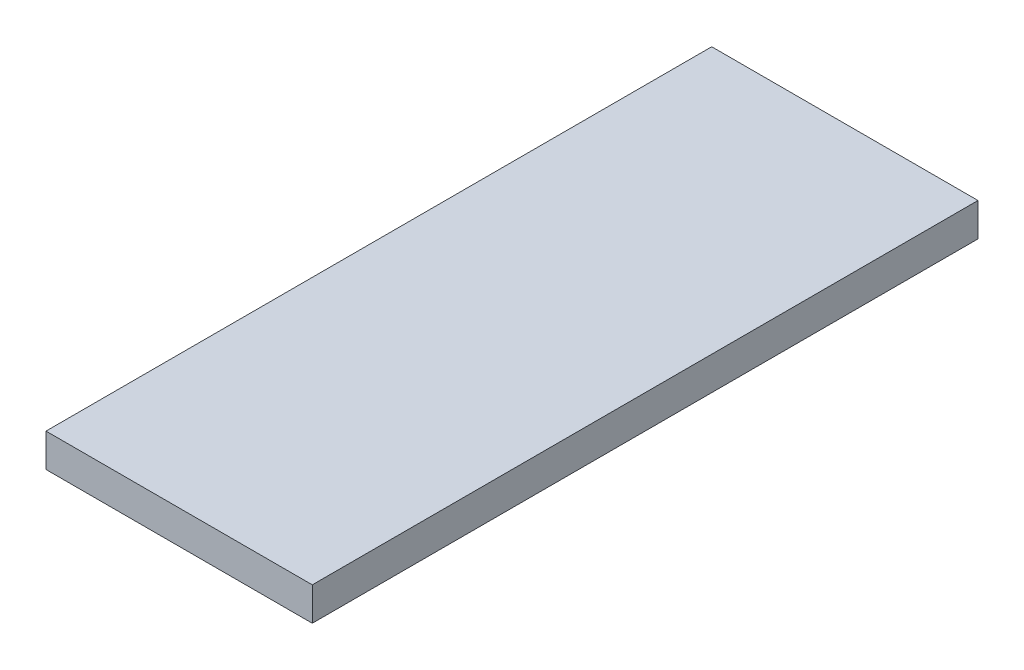
ISO-10303-21;
HEADER;
FILE_DESCRIPTION(('STEP AP214'),'2;1');
FILE_NAME('part.step','',(''),(''),'','','');
FILE_SCHEMA(('AUTOMOTIVE_DESIGN { 1 0 10303 214 1 1 1 1 }'));
ENDSEC;
DATA;
#1=APPLICATION_CONTEXT('core data for automotive mechanical design processes');
#2=APPLICATION_PROTOCOL_DEFINITION('international standard','automotive_design',2000,#1);
#3=PRODUCT_CONTEXT('',#1,'mechanical');
#4=PRODUCT('Part','Part','',(#3));
#5=PRODUCT_RELATED_PRODUCT_CATEGORY('part','',(#4));
#6=PRODUCT_DEFINITION_FORMATION('','',#4);
#7=PRODUCT_DEFINITION_CONTEXT('part definition',#1,'design');
#8=PRODUCT_DEFINITION('design','',#6,#7);
#9=PRODUCT_DEFINITION_SHAPE('','',#8);
#10=(LENGTH_UNIT() NAMED_UNIT(*) SI_UNIT(.MILLI.,.METRE.));
#11=(NAMED_UNIT(*) PLANE_ANGLE_UNIT() SI_UNIT($,.RADIAN.));
#12=(NAMED_UNIT(*) SI_UNIT($,.STERADIAN.) SOLID_ANGLE_UNIT());
#13=UNCERTAINTY_MEASURE_WITH_UNIT(LENGTH_MEASURE(1.E-05),#10,'distance_accuracy_value','');
#14=(GEOMETRIC_REPRESENTATION_CONTEXT(3) GLOBAL_UNCERTAINTY_ASSIGNED_CONTEXT((#13)) GLOBAL_UNIT_ASSIGNED_CONTEXT((#10,
#11,#12)) REPRESENTATION_CONTEXT('',''));
#15=CARTESIAN_POINT('',(0.,0.,0.));
#16=DIRECTION('',(0.,0.,1.));
#17=DIRECTION('',(1.,0.,0.));
#18=AXIS2_PLACEMENT_3D('',#15,#16,#17);
#19=CARTESIAN_POINT('',(4.,1.,-10.));
#20=DIRECTION('',(-1.,0.,0.));
#21=DIRECTION('',(0.,0.,1.));
#22=AXIS2_PLACEMENT_3D('',#19,#20,#21);
#23=PLANE('',#22);
#24=DIRECTION('',(0.,0.,-1.));
#25=VECTOR('',#24,1.);
#26=CARTESIAN_POINT('',(4.,0.,-10.));
#27=LINE('',#26,#25);
#28=CARTESIAN_POINT('',(4.,0.,9.99999999999999));
#29=VERTEX_POINT('',#28);
#30=CARTESIAN_POINT('',(4.,0.,-10.));
#31=VERTEX_POINT('',#30);
#32=EDGE_CURVE('E96',#29,#31,#27,.T.);
#33=ORIENTED_EDGE('',*,*,#32,.T.);
#34=DIRECTION('',(0.,-1.,0.));
#35=VECTOR('',#34,1.);
#36=CARTESIAN_POINT('',(4.,1.,-10.));
#37=LINE('',#36,#35);
#38=CARTESIAN_POINT('',(4.,1.,-10.));
#39=VERTEX_POINT('',#38);
#40=EDGE_CURVE('E11',#39,#31,#37,.T.);
#41=ORIENTED_EDGE('',*,*,#40,.F.);
#42=DIRECTION('',(0.,0.,-1.));
#43=VECTOR('',#42,1.);
#44=CARTESIAN_POINT('',(4.,1.,-10.));
#45=LINE('',#44,#43);
#46=CARTESIAN_POINT('',(4.,1.,9.99999999999999));
#47=VERTEX_POINT('',#46);
#48=EDGE_CURVE('E84',#47,#39,#45,.T.);
#49=ORIENTED_EDGE('',*,*,#48,.F.);
#50=DIRECTION('',(0.,-1.,0.));
#51=VECTOR('',#50,1.);
#52=CARTESIAN_POINT('',(4.,1.,9.99999999999999));
#53=LINE('',#52,#51);
#54=EDGE_CURVE('E92',#47,#29,#53,.T.);
#55=ORIENTED_EDGE('',*,*,#54,.T.);
#56=EDGE_LOOP('',(#33,#41,#49,#55));
#57=FACE_BOUND('',#56,.T.);
#58=ADVANCED_FACE('F33',(#57),#23,.F.);
#59=CARTESIAN_POINT('',(-4.,1.,-10.));
#60=DIRECTION('',(0.,0.,1.));
#61=DIRECTION('',(1.,0.,0.));
#62=AXIS2_PLACEMENT_3D('',#59,#60,#61);
#63=PLANE('',#62);
#64=DIRECTION('',(-1.,0.,0.));
#65=VECTOR('',#64,1.);
#66=CARTESIAN_POINT('',(-4.,0.,-10.));
#67=LINE('',#66,#65);
#68=CARTESIAN_POINT('',(-4.,0.,-10.));
#69=VERTEX_POINT('',#68);
#70=EDGE_CURVE('E88',#31,#69,#67,.T.);
#71=ORIENTED_EDGE('',*,*,#70,.T.);
#72=DIRECTION('',(0.,-1.,0.));
#73=VECTOR('',#72,1.);
#74=CARTESIAN_POINT('',(-4.,1.,-10.));
#75=LINE('',#74,#73);
#76=CARTESIAN_POINT('',(-4.,1.,-10.));
#77=VERTEX_POINT('',#76);
#78=EDGE_CURVE('E41',#77,#69,#75,.T.);
#79=ORIENTED_EDGE('',*,*,#78,.F.);
#80=DIRECTION('',(-1.,0.,0.));
#81=VECTOR('',#80,1.);
#82=CARTESIAN_POINT('',(-4.,1.,-10.));
#83=LINE('',#82,#81);
#84=EDGE_CURVE('E79',#39,#77,#83,.T.);
#85=ORIENTED_EDGE('',*,*,#84,.F.);
#86=ORIENTED_EDGE('',*,*,#40,.T.);
#87=EDGE_LOOP('',(#71,#79,#85,#86));
#88=FACE_BOUND('',#87,.T.);
#89=ADVANCED_FACE('F87',(#88),#63,.F.);
#90=CARTESIAN_POINT('',(-4.,1.,-10.));
#91=DIRECTION('',(1.,0.,0.));
#92=DIRECTION('',(0.,0.,-1.));
#93=AXIS2_PLACEMENT_3D('',#90,#91,#92);
#94=PLANE('',#93);
#95=DIRECTION('',(0.,0.,1.));
#96=VECTOR('',#95,1.);
#97=CARTESIAN_POINT('',(-4.,0.,-10.));
#98=LINE('',#97,#96);
#99=CARTESIAN_POINT('',(-4.,0.,9.99999999999999));
#100=VERTEX_POINT('',#99);
#101=EDGE_CURVE('E66',#69,#100,#98,.T.);
#102=ORIENTED_EDGE('',*,*,#101,.T.);
#103=DIRECTION('',(0.,-1.,0.));
#104=VECTOR('',#103,1.);
#105=CARTESIAN_POINT('',(-4.,1.,9.99999999999999));
#106=LINE('',#105,#104);
#107=CARTESIAN_POINT('',(-4.,1.,9.99999999999999));
#108=VERTEX_POINT('',#107);
#109=EDGE_CURVE('E89',#108,#100,#106,.T.);
#110=ORIENTED_EDGE('',*,*,#109,.F.);
#111=DIRECTION('',(0.,0.,1.));
#112=VECTOR('',#111,1.);
#113=CARTESIAN_POINT('',(-4.,1.,-10.));
#114=LINE('',#113,#112);
#115=EDGE_CURVE('E82',#77,#108,#114,.T.);
#116=ORIENTED_EDGE('',*,*,#115,.F.);
#117=ORIENTED_EDGE('',*,*,#78,.T.);
#118=EDGE_LOOP('',(#102,#110,#116,#117));
#119=FACE_BOUND('',#118,.T.);
#120=ADVANCED_FACE('F90',(#119),#94,.F.);
#121=CARTESIAN_POINT('',(-4.,1.,9.99999999999999));
#122=DIRECTION('',(0.,0.,-1.));
#123=DIRECTION('',(-1.,0.,0.));
#124=AXIS2_PLACEMENT_3D('',#121,#122,#123);
#125=PLANE('',#124);
#126=DIRECTION('',(1.,0.,0.));
#127=VECTOR('',#126,1.);
#128=CARTESIAN_POINT('',(-4.,0.,9.99999999999999));
#129=LINE('',#128,#127);
#130=EDGE_CURVE('E72',#100,#29,#129,.T.);
#131=ORIENTED_EDGE('',*,*,#130,.T.);
#132=ORIENTED_EDGE('',*,*,#54,.F.);
#133=DIRECTION('',(1.,0.,0.));
#134=VECTOR('',#133,1.);
#135=CARTESIAN_POINT('',(-4.,1.,9.99999999999999));
#136=LINE('',#135,#134);
#137=EDGE_CURVE('E49',#108,#47,#136,.T.);
#138=ORIENTED_EDGE('',*,*,#137,.F.);
#139=ORIENTED_EDGE('',*,*,#109,.T.);
#140=EDGE_LOOP('',(#131,#132,#138,#139));
#141=FACE_BOUND('',#140,.T.);
#142=ADVANCED_FACE('F103',(#141),#125,.F.);
#143=CARTESIAN_POINT('',(0.,1.,0.));
#144=DIRECTION('',(0.,1.,0.));
#145=DIRECTION('',(0.,0.,1.));
#146=AXIS2_PLACEMENT_3D('',#143,#144,#145);
#147=PLANE('',#146);
#148=ORIENTED_EDGE('',*,*,#48,.T.);
#149=ORIENTED_EDGE('',*,*,#84,.T.);
#150=ORIENTED_EDGE('',*,*,#115,.T.);
#151=ORIENTED_EDGE('',*,*,#137,.T.);
#152=EDGE_LOOP('',(#148,#149,#150,#151));
#153=FACE_BOUND('',#152,.T.);
#154=ADVANCED_FACE('F80',(#153),#147,.T.);
#155=CARTESIAN_POINT('',(0.,0.,0.));
#156=DIRECTION('',(0.,1.,0.));
#157=DIRECTION('',(0.,0.,1.));
#158=AXIS2_PLACEMENT_3D('',#155,#156,#157);
#159=PLANE('',#158);
#160=ORIENTED_EDGE('',*,*,#32,.F.);
#161=ORIENTED_EDGE('',*,*,#130,.F.);
#162=ORIENTED_EDGE('',*,*,#101,.F.);
#163=ORIENTED_EDGE('',*,*,#70,.F.);
#164=EDGE_LOOP('',(#160,#161,#162,#163));
#165=FACE_BOUND('',#164,.T.);
#166=ADVANCED_FACE('F106',(#165),#159,.F.);
#167=CLOSED_SHELL('',(#58,#89,#120,#142,#154,#166));
#168=MANIFOLD_SOLID_BREP('B2',#167);
#169=ADVANCED_BREP_SHAPE_REPRESENTATION('',(#18,#168),#14);
#170=SHAPE_DEFINITION_REPRESENTATION(#9,#169);
ENDSEC;
END-ISO-10303-21;
